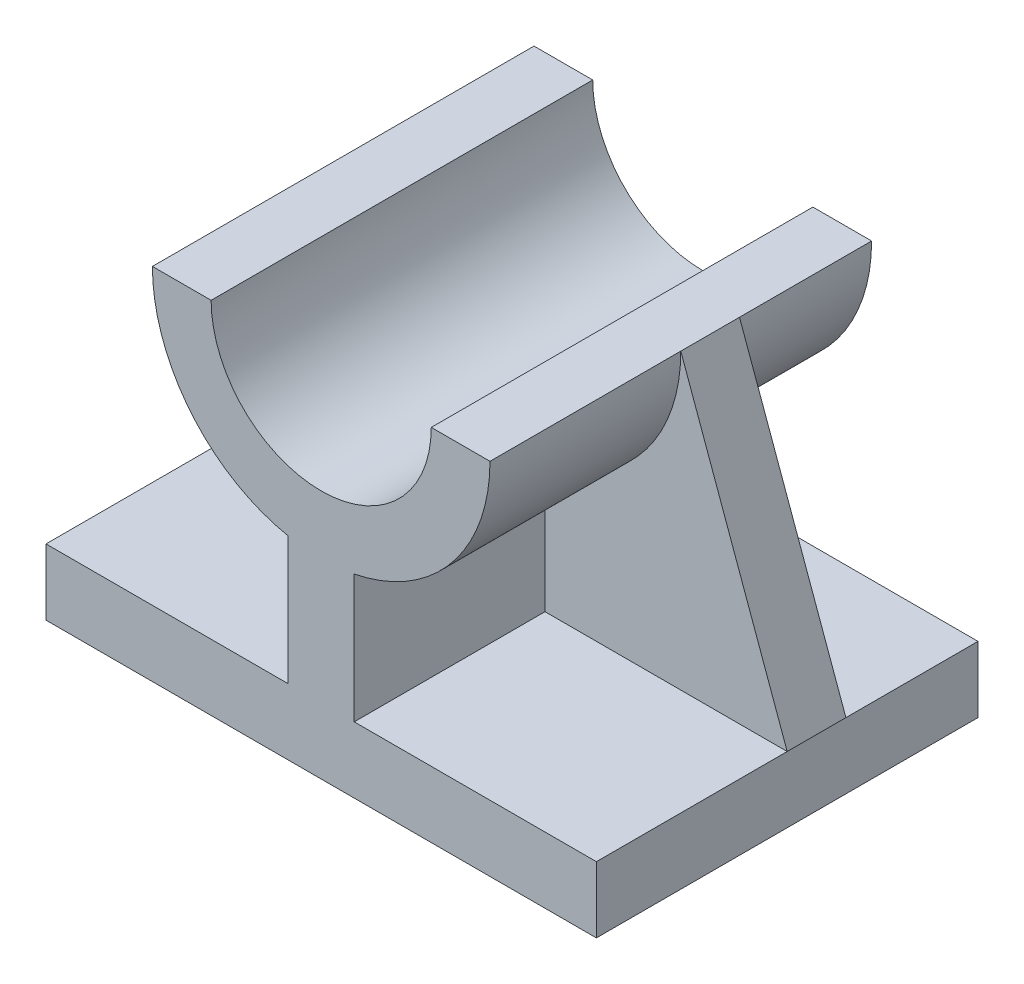
ISO-10303-21;
HEADER;
FILE_DESCRIPTION(('STEP AP214'),'2;1');
FILE_NAME('part.step','',(''),(''),'','','');
FILE_SCHEMA(('AUTOMOTIVE_DESIGN { 1 0 10303 214 1 1 1 1 }'));
ENDSEC;
DATA;
#1=APPLICATION_CONTEXT('core data for automotive mechanical design processes');
#2=APPLICATION_PROTOCOL_DEFINITION('international standard','automotive_design',2000,#1);
#3=PRODUCT_CONTEXT('',#1,'mechanical');
#4=PRODUCT('Part','Part','',(#3));
#5=PRODUCT_RELATED_PRODUCT_CATEGORY('part','',(#4));
#6=PRODUCT_DEFINITION_FORMATION('','',#4);
#7=PRODUCT_DEFINITION_CONTEXT('part definition',#1,'design');
#8=PRODUCT_DEFINITION('design','',#6,#7);
#9=PRODUCT_DEFINITION_SHAPE('','',#8);
#10=(LENGTH_UNIT() NAMED_UNIT(*) SI_UNIT(.MILLI.,.METRE.));
#11=(NAMED_UNIT(*) PLANE_ANGLE_UNIT() SI_UNIT($,.RADIAN.));
#12=(NAMED_UNIT(*) SI_UNIT($,.STERADIAN.) SOLID_ANGLE_UNIT());
#13=UNCERTAINTY_MEASURE_WITH_UNIT(LENGTH_MEASURE(1.E-05),#10,'distance_accuracy_value','');
#14=(GEOMETRIC_REPRESENTATION_CONTEXT(3) GLOBAL_UNCERTAINTY_ASSIGNED_CONTEXT((#13)) GLOBAL_UNIT_ASSIGNED_CONTEXT((#10,
#11,#12)) REPRESENTATION_CONTEXT('',''));
#15=CARTESIAN_POINT('',(0.,0.,0.));
#16=DIRECTION('',(0.,0.,1.));
#17=DIRECTION('',(1.,0.,0.));
#18=AXIS2_PLACEMENT_3D('',#15,#16,#17);
#19=CARTESIAN_POINT('',(0.,9.,0.));
#20=DIRECTION('',(0.,-1.,0.));
#21=DIRECTION('',(0.,0.,-1.));
#22=AXIS2_PLACEMENT_3D('',#19,#20,#21);
#23=PLANE('',#22);
#24=DIRECTION('',(-1.,0.,0.));
#25=VECTOR('',#24,1.);
#26=CARTESIAN_POINT('',(0.,9.,-34.));
#27=LINE('',#26,#25);
#28=CARTESIAN_POINT('',(33.,9.,-34.));
#29=VERTEX_POINT('',#28);
#30=CARTESIAN_POINT('',(0.,9.,-34.));
#31=VERTEX_POINT('',#30);
#32=EDGE_CURVE('E185',#29,#31,#27,.T.);
#33=ORIENTED_EDGE('',*,*,#32,.F.);
#34=DIRECTION('',(0.,0.,1.));
#35=VECTOR('',#34,1.);
#36=CARTESIAN_POINT('',(33.,9.,-52.));
#37=LINE('',#36,#35);
#38=CARTESIAN_POINT('',(33.,9.,-52.));
#39=VERTEX_POINT('',#38);
#40=EDGE_CURVE('E245',#39,#29,#37,.T.);
#41=ORIENTED_EDGE('',*,*,#40,.F.);
#42=DIRECTION('',(-1.,0.,0.));
#43=VECTOR('',#42,1.);
#44=CARTESIAN_POINT('',(0.,9.,-52.));
#45=LINE('',#44,#43);
#46=CARTESIAN_POINT('',(0.,9.,-52.));
#47=VERTEX_POINT('',#46);
#48=EDGE_CURVE('E237',#39,#47,#45,.T.);
#49=ORIENTED_EDGE('',*,*,#48,.T.);
#50=DIRECTION('',(0.,0.,1.));
#51=VECTOR('',#50,1.);
#52=CARTESIAN_POINT('',(0.,9.,0.));
#53=LINE('',#52,#51);
#54=EDGE_CURVE('E225',#47,#31,#53,.T.);
#55=ORIENTED_EDGE('',*,*,#54,.T.);
#56=EDGE_LOOP('',(#33,#41,#49,#55));
#57=FACE_BOUND('',#56,.T.);
#58=ADVANCED_FACE('F33',(#57),#23,.F.);
#59=CARTESIAN_POINT('',(33.,9.,-52.));
#60=DIRECTION('',(-1.,0.,0.));
#61=DIRECTION('',(0.,0.,1.));
#62=AXIS2_PLACEMENT_3D('',#59,#60,#61);
#63=PLANE('',#62);
#64=ORIENTED_EDGE('',*,*,#40,.T.);
#65=DIRECTION('',(0.,1.,0.));
#66=VECTOR('',#65,1.);
#67=CARTESIAN_POINT('',(33.,9.,-34.));
#68=LINE('',#67,#66);
#69=CARTESIAN_POINT('',(33.,26.4445128627201,-34.));
#70=VERTEX_POINT('',#69);
#71=EDGE_CURVE('E193',#29,#70,#68,.T.);
#72=ORIENTED_EDGE('',*,*,#71,.T.);
#73=DIRECTION('',(0.,0.,1.));
#74=VECTOR('',#73,1.);
#75=CARTESIAN_POINT('',(33.,26.4445128627201,-52.));
#76=LINE('',#75,#74);
#77=CARTESIAN_POINT('',(33.,26.4445128627201,-52.));
#78=VERTEX_POINT('',#77);
#79=EDGE_CURVE('E192',#78,#70,#76,.T.);
#80=ORIENTED_EDGE('',*,*,#79,.F.);
#81=DIRECTION('',(0.,-1.,0.));
#82=VECTOR('',#81,1.);
#83=CARTESIAN_POINT('',(33.,9.,-52.));
#84=LINE('',#83,#82);
#85=EDGE_CURVE('E297',#78,#39,#84,.T.);
#86=ORIENTED_EDGE('',*,*,#85,.T.);
#87=EDGE_LOOP('',(#64,#72,#80,#86));
#88=FACE_BOUND('',#87,.T.);
#89=ADVANCED_FACE('F354',(#88),#63,.T.);
#90=CARTESIAN_POINT('',(37.5,49.,-52.));
#91=DIRECTION('',(0.,0.,1.));
#92=DIRECTION('',(1.,0.,0.));
#93=AXIS2_PLACEMENT_3D('',#90,#91,#92);
#94=CYLINDRICAL_SURFACE('',#93,23.);
#95=ORIENTED_EDGE('',*,*,#79,.T.);
#96=CARTESIAN_POINT('',(37.5,49.,-34.));
#97=DIRECTION('',(0.,0.,1.));
#98=DIRECTION('',(1.,0.,0.));
#99=AXIS2_PLACEMENT_3D('',#96,#97,#98);
#100=CIRCLE('',#99,23.);
#101=CARTESIAN_POINT('',(14.5,49.,-34.));
#102=VERTEX_POINT('',#101);
#103=EDGE_CURVE('E182',#70,#102,#100,.F.);
#104=ORIENTED_EDGE('',*,*,#103,.T.);
#105=DIRECTION('',(0.,0.,1.));
#106=VECTOR('',#105,1.);
#107=CARTESIAN_POINT('',(14.5,49.,-52.));
#108=LINE('',#107,#106);
#109=CARTESIAN_POINT('',(14.5,49.,-52.));
#110=VERTEX_POINT('',#109);
#111=EDGE_CURVE('E176',#110,#102,#108,.T.);
#112=ORIENTED_EDGE('',*,*,#111,.F.);
#113=CARTESIAN_POINT('',(37.5,49.,-52.));
#114=DIRECTION('',(0.,0.,1.));
#115=DIRECTION('',(1.,0.,0.));
#116=AXIS2_PLACEMENT_3D('',#113,#114,#115);
#117=CIRCLE('',#116,23.);
#118=EDGE_CURVE('E295',#110,#78,#117,.T.);
#119=ORIENTED_EDGE('',*,*,#118,.T.);
#120=EDGE_LOOP('',(#95,#104,#112,#119));
#121=FACE_BOUND('',#120,.T.);
#122=ADVANCED_FACE('F189',(#121),#94,.T.);
#123=DIRECTION('',(-1.,0.,0.));
#124=VECTOR('',#123,1.);
#125=CARTESIAN_POINT('',(0.,9.,-34.));
#126=LINE('',#125,#124);
#127=CARTESIAN_POINT('',(75.,9.,-34.));
#128=VERTEX_POINT('',#127);
#129=CARTESIAN_POINT('',(42.,9.,-34.));
#130=VERTEX_POINT('',#129);
#131=EDGE_CURVE('E56',#128,#130,#126,.T.);
#132=ORIENTED_EDGE('',*,*,#131,.F.);
#133=DIRECTION('',(0.,0.,-1.));
#134=VECTOR('',#133,1.);
#135=CARTESIAN_POINT('',(75.,9.,0.));
#136=LINE('',#135,#134);
#137=CARTESIAN_POINT('',(75.,9.,-52.));
#138=VERTEX_POINT('',#137);
#139=EDGE_CURVE('E233',#128,#138,#136,.T.);
#140=ORIENTED_EDGE('',*,*,#139,.T.);
#141=CARTESIAN_POINT('',(42.,9.,-52.));
#142=VERTEX_POINT('',#141);
#143=EDGE_CURVE('E238',#138,#142,#45,.T.);
#144=ORIENTED_EDGE('',*,*,#143,.T.);
#145=DIRECTION('',(0.,0.,1.));
#146=VECTOR('',#145,1.);
#147=CARTESIAN_POINT('',(42.,9.,-52.));
#148=LINE('',#147,#146);
#149=EDGE_CURVE('E221',#142,#130,#148,.T.);
#150=ORIENTED_EDGE('',*,*,#149,.T.);
#151=EDGE_LOOP('',(#132,#140,#144,#150));
#152=FACE_BOUND('',#151,.T.);
#153=ADVANCED_FACE('F267',(#152),#23,.F.);
#154=CARTESIAN_POINT('',(37.5,49.,-52.));
#155=DIRECTION('',(0.,0.,1.));
#156=DIRECTION('',(1.,0.,0.));
#157=AXIS2_PLACEMENT_3D('',#154,#155,#156);
#158=CYLINDRICAL_SURFACE('',#157,23.);
#159=DIRECTION('',(0.,0.,1.));
#160=VECTOR('',#159,1.);
#161=CARTESIAN_POINT('',(60.5,49.,-52.));
#162=LINE('',#161,#160);
#163=CARTESIAN_POINT('',(60.5,49.,-52.));
#164=VERTEX_POINT('',#163);
#165=CARTESIAN_POINT('',(60.5,49.,-34.));
#166=VERTEX_POINT('',#165);
#167=EDGE_CURVE('E210',#164,#166,#162,.T.);
#168=ORIENTED_EDGE('',*,*,#167,.T.);
#169=CARTESIAN_POINT('',(37.5,49.,-34.));
#170=DIRECTION('',(0.,0.,1.));
#171=DIRECTION('',(1.,0.,0.));
#172=AXIS2_PLACEMENT_3D('',#169,#170,#171);
#173=CIRCLE('',#172,23.);
#174=CARTESIAN_POINT('',(42.,26.4445128627201,-34.));
#175=VERTEX_POINT('',#174);
#176=EDGE_CURVE('E367',#166,#175,#173,.F.);
#177=ORIENTED_EDGE('',*,*,#176,.T.);
#178=DIRECTION('',(0.,0.,1.));
#179=VECTOR('',#178,1.);
#180=CARTESIAN_POINT('',(42.,26.4445128627201,-52.));
#181=LINE('',#180,#179);
#182=CARTESIAN_POINT('',(42.,26.4445128627201,-52.));
#183=VERTEX_POINT('',#182);
#184=EDGE_CURVE('E217',#183,#175,#181,.T.);
#185=ORIENTED_EDGE('',*,*,#184,.F.);
#186=CARTESIAN_POINT('',(37.5,49.,-52.));
#187=DIRECTION('',(0.,0.,1.));
#188=DIRECTION('',(1.,0.,0.));
#189=AXIS2_PLACEMENT_3D('',#186,#187,#188);
#190=CIRCLE('',#189,23.);
#191=EDGE_CURVE('E278',#183,#164,#190,.T.);
#192=ORIENTED_EDGE('',*,*,#191,.T.);
#193=EDGE_LOOP('',(#168,#177,#185,#192));
#194=FACE_BOUND('',#193,.T.);
#195=ADVANCED_FACE('F396',(#194),#158,.T.);
#196=CARTESIAN_POINT('',(42.,9.,-52.));
#197=DIRECTION('',(1.,0.,0.));
#198=DIRECTION('',(0.,0.,-1.));
#199=AXIS2_PLACEMENT_3D('',#196,#197,#198);
#200=PLANE('',#199);
#201=ORIENTED_EDGE('',*,*,#184,.T.);
#202=DIRECTION('',(0.,-1.,0.));
#203=VECTOR('',#202,1.);
#204=CARTESIAN_POINT('',(42.,9.,-34.));
#205=LINE('',#204,#203);
#206=EDGE_CURVE('E41',#175,#130,#205,.T.);
#207=ORIENTED_EDGE('',*,*,#206,.T.);
#208=ORIENTED_EDGE('',*,*,#149,.F.);
#209=DIRECTION('',(0.,1.,0.));
#210=VECTOR('',#209,1.);
#211=CARTESIAN_POINT('',(42.,9.,-52.));
#212=LINE('',#211,#210);
#213=EDGE_CURVE('E275',#142,#183,#212,.T.);
#214=ORIENTED_EDGE('',*,*,#213,.T.);
#215=EDGE_LOOP('',(#201,#207,#208,#214));
#216=FACE_BOUND('',#215,.T.);
#217=ADVANCED_FACE('F262',(#216),#200,.T.);
#218=CARTESIAN_POINT('',(33.,9.,-26.));
#219=VERTEX_POINT('',#218);
#220=CARTESIAN_POINT('',(33.,9.,0.));
#221=VERTEX_POINT('',#220);
#222=EDGE_CURVE('E317',#219,#221,#37,.T.);
#223=ORIENTED_EDGE('',*,*,#222,.F.);
#224=DIRECTION('',(-1.,0.,0.));
#225=VECTOR('',#224,1.);
#226=CARTESIAN_POINT('',(0.,9.,-26.));
#227=LINE('',#226,#225);
#228=CARTESIAN_POINT('',(0.,9.,-26.));
#229=VERTEX_POINT('',#228);
#230=EDGE_CURVE('E333',#219,#229,#227,.T.);
#231=ORIENTED_EDGE('',*,*,#230,.T.);
#232=CARTESIAN_POINT('',(0.,9.,0.));
#233=VERTEX_POINT('',#232);
#234=EDGE_CURVE('E229',#229,#233,#53,.T.);
#235=ORIENTED_EDGE('',*,*,#234,.T.);
#236=DIRECTION('',(1.,0.,0.));
#237=VECTOR('',#236,1.);
#238=CARTESIAN_POINT('',(0.,9.,0.));
#239=LINE('',#238,#237);
#240=EDGE_CURVE('E230',#233,#221,#239,.T.);
#241=ORIENTED_EDGE('',*,*,#240,.T.);
#242=EDGE_LOOP('',(#223,#231,#235,#241));
#243=FACE_BOUND('',#242,.T.);
#244=ADVANCED_FACE('F331',(#243),#23,.F.);
#245=CARTESIAN_POINT('',(0.,9.,0.));
#246=DIRECTION('',(1.,0.,0.));
#247=DIRECTION('',(0.,0.,-1.));
#248=AXIS2_PLACEMENT_3D('',#245,#246,#247);
#249=PLANE('',#248);
#250=ORIENTED_EDGE('',*,*,#234,.F.);
#251=DIRECTION('',(0.,0.,1.));
#252=VECTOR('',#251,1.);
#253=CARTESIAN_POINT('',(0.,9.,0.));
#254=LINE('',#253,#252);
#255=EDGE_CURVE('E336',#31,#229,#254,.T.);
#256=ORIENTED_EDGE('',*,*,#255,.F.);
#257=ORIENTED_EDGE('',*,*,#54,.F.);
#258=DIRECTION('',(0.,-1.,0.));
#259=VECTOR('',#258,1.);
#260=CARTESIAN_POINT('',(0.,9.,-52.));
#261=LINE('',#260,#259);
#262=CARTESIAN_POINT('',(0.,0.,-52.));
#263=VERTEX_POINT('',#262);
#264=EDGE_CURVE('E241',#47,#263,#261,.T.);
#265=ORIENTED_EDGE('',*,*,#264,.T.);
#266=DIRECTION('',(0.,0.,1.));
#267=VECTOR('',#266,1.);
#268=CARTESIAN_POINT('',(0.,0.,0.));
#269=LINE('',#268,#267);
#270=CARTESIAN_POINT('',(0.,0.,0.));
#271=VERTEX_POINT('',#270);
#272=EDGE_CURVE('E242',#263,#271,#269,.T.);
#273=ORIENTED_EDGE('',*,*,#272,.T.);
#274=DIRECTION('',(0.,-1.,0.));
#275=VECTOR('',#274,1.);
#276=CARTESIAN_POINT('',(0.,9.,0.));
#277=LINE('',#276,#275);
#278=EDGE_CURVE('E259',#233,#271,#277,.T.);
#279=ORIENTED_EDGE('',*,*,#278,.F.);
#280=EDGE_LOOP('',(#250,#256,#257,#265,#273,#279));
#281=FACE_BOUND('',#280,.T.);
#282=ADVANCED_FACE('F35',(#281),#249,.F.);
#283=CARTESIAN_POINT('',(0.,9.,0.));
#284=DIRECTION('',(0.,0.,-1.));
#285=DIRECTION('',(-1.,0.,0.));
#286=AXIS2_PLACEMENT_3D('',#283,#284,#285);
#287=PLANE('',#286);
#288=DIRECTION('',(1.,0.,0.));
#289=VECTOR('',#288,1.);
#290=CARTESIAN_POINT('',(0.,0.,0.));
#291=LINE('',#290,#289);
#292=CARTESIAN_POINT('',(75.,0.,0.));
#293=VERTEX_POINT('',#292);
#294=EDGE_CURVE('E244',#271,#293,#291,.T.);
#295=ORIENTED_EDGE('',*,*,#294,.T.);
#296=DIRECTION('',(0.,-1.,0.));
#297=VECTOR('',#296,1.);
#298=CARTESIAN_POINT('',(75.,9.,0.));
#299=LINE('',#298,#297);
#300=CARTESIAN_POINT('',(75.,9.,0.));
#301=VERTEX_POINT('',#300);
#302=EDGE_CURVE('E256',#301,#293,#299,.T.);
#303=ORIENTED_EDGE('',*,*,#302,.F.);
#304=CARTESIAN_POINT('',(42.,9.,0.));
#305=VERTEX_POINT('',#304);
#306=EDGE_CURVE('E228',#305,#301,#239,.T.);
#307=ORIENTED_EDGE('',*,*,#306,.F.);
#308=DIRECTION('',(0.,1.,0.));
#309=VECTOR('',#308,1.);
#310=CARTESIAN_POINT('',(42.,9.,0.));
#311=LINE('',#310,#309);
#312=CARTESIAN_POINT('',(42.,26.4445128627201,0.));
#313=VERTEX_POINT('',#312);
#314=EDGE_CURVE('E299',#305,#313,#311,.T.);
#315=ORIENTED_EDGE('',*,*,#314,.T.);
#316=CARTESIAN_POINT('',(37.5,49.,0.));
#317=DIRECTION('',(0.,0.,1.));
#318=DIRECTION('',(1.,0.,0.));
#319=AXIS2_PLACEMENT_3D('',#316,#317,#318);
#320=CIRCLE('',#319,23.);
#321=CARTESIAN_POINT('',(60.5,49.,0.));
#322=VERTEX_POINT('',#321);
#323=EDGE_CURVE('E302',#313,#322,#320,.T.);
#324=ORIENTED_EDGE('',*,*,#323,.T.);
#325=DIRECTION('',(-1.,0.,0.));
#326=VECTOR('',#325,1.);
#327=CARTESIAN_POINT('',(52.5,49.,0.));
#328=LINE('',#327,#326);
#329=CARTESIAN_POINT('',(52.5,49.,0.));
#330=VERTEX_POINT('',#329);
#331=EDGE_CURVE('E305',#322,#330,#328,.T.);
#332=ORIENTED_EDGE('',*,*,#331,.T.);
#333=CARTESIAN_POINT('',(37.5,49.,0.));
#334=DIRECTION('',(0.,0.,-1.));
#335=DIRECTION('',(1.,0.,0.));
#336=AXIS2_PLACEMENT_3D('',#333,#334,#335);
#337=CIRCLE('',#336,15.);
#338=CARTESIAN_POINT('',(22.5,49.,0.));
#339=VERTEX_POINT('',#338);
#340=EDGE_CURVE('E308',#330,#339,#337,.T.);
#341=ORIENTED_EDGE('',*,*,#340,.T.);
#342=DIRECTION('',(-1.,0.,0.));
#343=VECTOR('',#342,1.);
#344=CARTESIAN_POINT('',(14.5,49.,0.));
#345=LINE('',#344,#343);
#346=CARTESIAN_POINT('',(14.5,49.,0.));
#347=VERTEX_POINT('',#346);
#348=EDGE_CURVE('E311',#339,#347,#345,.T.);
#349=ORIENTED_EDGE('',*,*,#348,.T.);
#350=CARTESIAN_POINT('',(37.5,49.,0.));
#351=DIRECTION('',(0.,0.,1.));
#352=DIRECTION('',(1.,0.,0.));
#353=AXIS2_PLACEMENT_3D('',#350,#351,#352);
#354=CIRCLE('',#353,23.);
#355=CARTESIAN_POINT('',(33.,26.4445128627201,0.));
#356=VERTEX_POINT('',#355);
#357=EDGE_CURVE('E284',#347,#356,#354,.T.);
#358=ORIENTED_EDGE('',*,*,#357,.T.);
#359=DIRECTION('',(0.,-1.,0.));
#360=VECTOR('',#359,1.);
#361=CARTESIAN_POINT('',(33.,9.,0.));
#362=LINE('',#361,#360);
#363=EDGE_CURVE('E279',#356,#221,#362,.T.);
#364=ORIENTED_EDGE('',*,*,#363,.T.);
#365=ORIENTED_EDGE('',*,*,#240,.F.);
#366=ORIENTED_EDGE('',*,*,#278,.T.);
#367=EDGE_LOOP('',(#295,#303,#307,#315,#324,#332,#341,#349,#358,#364,#365,#366));
#368=FACE_BOUND('',#367,.T.);
#369=ADVANCED_FACE('F329',(#368),#287,.F.);
#370=CARTESIAN_POINT('',(75.,9.,0.));
#371=DIRECTION('',(-1.,0.,0.));
#372=DIRECTION('',(0.,0.,1.));
#373=AXIS2_PLACEMENT_3D('',#370,#371,#372);
#374=PLANE('',#373);
#375=DIRECTION('',(0.,0.,-1.));
#376=VECTOR('',#375,1.);
#377=CARTESIAN_POINT('',(75.,0.,0.));
#378=LINE('',#377,#376);
#379=CARTESIAN_POINT('',(75.,0.,-52.));
#380=VERTEX_POINT('',#379);
#381=EDGE_CURVE('E247',#293,#380,#378,.T.);
#382=ORIENTED_EDGE('',*,*,#381,.T.);
#383=DIRECTION('',(0.,-1.,0.));
#384=VECTOR('',#383,1.);
#385=CARTESIAN_POINT('',(75.,9.,-52.));
#386=LINE('',#385,#384);
#387=EDGE_CURVE('E253',#138,#380,#386,.T.);
#388=ORIENTED_EDGE('',*,*,#387,.F.);
#389=ORIENTED_EDGE('',*,*,#139,.F.);
#390=DIRECTION('',(0.,0.,-1.));
#391=VECTOR('',#390,1.);
#392=CARTESIAN_POINT('',(75.,9.,0.));
#393=LINE('',#392,#391);
#394=CARTESIAN_POINT('',(75.,9.,-26.));
#395=VERTEX_POINT('',#394);
#396=EDGE_CURVE('E287',#128,#395,#393,.F.);
#397=ORIENTED_EDGE('',*,*,#396,.T.);
#398=EDGE_CURVE('E234',#301,#395,#136,.T.);
#399=ORIENTED_EDGE('',*,*,#398,.F.);
#400=ORIENTED_EDGE('',*,*,#302,.T.);
#401=EDGE_LOOP('',(#382,#388,#389,#397,#399,#400));
#402=FACE_BOUND('',#401,.T.);
#403=ADVANCED_FACE('F345',(#402),#374,.F.);
#404=CARTESIAN_POINT('',(0.,9.,-52.));
#405=DIRECTION('',(0.,0.,1.));
#406=DIRECTION('',(1.,0.,0.));
#407=AXIS2_PLACEMENT_3D('',#404,#405,#406);
#408=PLANE('',#407);
#409=DIRECTION('',(-1.,0.,0.));
#410=VECTOR('',#409,1.);
#411=CARTESIAN_POINT('',(0.,0.,-52.));
#412=LINE('',#411,#410);
#413=EDGE_CURVE('E249',#380,#263,#412,.T.);
#414=ORIENTED_EDGE('',*,*,#413,.T.);
#415=ORIENTED_EDGE('',*,*,#264,.F.);
#416=ORIENTED_EDGE('',*,*,#48,.F.);
#417=ORIENTED_EDGE('',*,*,#85,.F.);
#418=ORIENTED_EDGE('',*,*,#118,.F.);
#419=DIRECTION('',(-1.,0.,0.));
#420=VECTOR('',#419,1.);
#421=CARTESIAN_POINT('',(14.5,49.,-52.));
#422=LINE('',#421,#420);
#423=CARTESIAN_POINT('',(22.5,49.,-52.));
#424=VERTEX_POINT('',#423);
#425=EDGE_CURVE('E199',#424,#110,#422,.T.);
#426=ORIENTED_EDGE('',*,*,#425,.F.);
#427=CARTESIAN_POINT('',(37.5,49.,-52.));
#428=DIRECTION('',(0.,0.,-1.));
#429=DIRECTION('',(1.,0.,0.));
#430=AXIS2_PLACEMENT_3D('',#427,#428,#429);
#431=CIRCLE('',#430,15.);
#432=CARTESIAN_POINT('',(52.5,49.,-52.));
#433=VERTEX_POINT('',#432);
#434=EDGE_CURVE('E292',#433,#424,#431,.T.);
#435=ORIENTED_EDGE('',*,*,#434,.F.);
#436=DIRECTION('',(-1.,0.,0.));
#437=VECTOR('',#436,1.);
#438=CARTESIAN_POINT('',(52.5,49.,-52.));
#439=LINE('',#438,#437);
#440=EDGE_CURVE('E281',#164,#433,#439,.T.);
#441=ORIENTED_EDGE('',*,*,#440,.F.);
#442=ORIENTED_EDGE('',*,*,#191,.F.);
#443=ORIENTED_EDGE('',*,*,#213,.F.);
#444=ORIENTED_EDGE('',*,*,#143,.F.);
#445=ORIENTED_EDGE('',*,*,#387,.T.);
#446=EDGE_LOOP('',(#414,#415,#416,#417,#418,#426,#435,#441,#442,#443,#444,#445));
#447=FACE_BOUND('',#446,.T.);
#448=ADVANCED_FACE('F272',(#447),#408,.F.);
#449=ORIENTED_EDGE('',*,*,#398,.T.);
#450=DIRECTION('',(-1.,0.,0.));
#451=VECTOR('',#450,1.);
#452=CARTESIAN_POINT('',(0.,9.,-26.));
#453=LINE('',#452,#451);
#454=CARTESIAN_POINT('',(42.,9.,-26.));
#455=VERTEX_POINT('',#454);
#456=EDGE_CURVE('E372',#395,#455,#453,.T.);
#457=ORIENTED_EDGE('',*,*,#456,.T.);
#458=EDGE_CURVE('E224',#455,#305,#148,.T.);
#459=ORIENTED_EDGE('',*,*,#458,.T.);
#460=ORIENTED_EDGE('',*,*,#306,.T.);
#461=EDGE_LOOP('',(#449,#457,#459,#460));
#462=FACE_BOUND('',#461,.T.);
#463=ADVANCED_FACE('F378',(#462),#23,.F.);
#464=CARTESIAN_POINT('',(0.,0.,0.));
#465=DIRECTION('',(0.,-1.,0.));
#466=DIRECTION('',(0.,0.,-1.));
#467=AXIS2_PLACEMENT_3D('',#464,#465,#466);
#468=PLANE('',#467);
#469=ORIENTED_EDGE('',*,*,#294,.F.);
#470=ORIENTED_EDGE('',*,*,#272,.F.);
#471=ORIENTED_EDGE('',*,*,#413,.F.);
#472=ORIENTED_EDGE('',*,*,#381,.F.);
#473=EDGE_LOOP('',(#469,#470,#471,#472));
#474=FACE_BOUND('',#473,.T.);
#475=ADVANCED_FACE('F347',(#474),#468,.T.);
#476=DIRECTION('',(0.,1.,0.));
#477=VECTOR('',#476,1.);
#478=CARTESIAN_POINT('',(33.,9.,-26.));
#479=LINE('',#478,#477);
#480=CARTESIAN_POINT('',(33.,26.4445128627201,-26.));
#481=VERTEX_POINT('',#480);
#482=EDGE_CURVE('E324',#219,#481,#479,.T.);
#483=ORIENTED_EDGE('',*,*,#482,.F.);
#484=ORIENTED_EDGE('',*,*,#222,.T.);
#485=ORIENTED_EDGE('',*,*,#363,.F.);
#486=EDGE_CURVE('E200',#481,#356,#76,.T.);
#487=ORIENTED_EDGE('',*,*,#486,.F.);
#488=EDGE_LOOP('',(#483,#484,#485,#487));
#489=FACE_BOUND('',#488,.T.);
#490=ADVANCED_FACE('F322',(#489),#63,.T.);
#491=CARTESIAN_POINT('',(37.5,49.,-26.));
#492=DIRECTION('',(0.,0.,1.));
#493=DIRECTION('',(1.,0.,0.));
#494=AXIS2_PLACEMENT_3D('',#491,#492,#493);
#495=CIRCLE('',#494,23.);
#496=CARTESIAN_POINT('',(14.5,49.,-26.));
#497=VERTEX_POINT('',#496);
#498=EDGE_CURVE('E356',#481,#497,#495,.F.);
#499=ORIENTED_EDGE('',*,*,#498,.F.);
#500=ORIENTED_EDGE('',*,*,#486,.T.);
#501=ORIENTED_EDGE('',*,*,#357,.F.);
#502=EDGE_CURVE('E177',#497,#347,#108,.T.);
#503=ORIENTED_EDGE('',*,*,#502,.F.);
#504=EDGE_LOOP('',(#499,#500,#501,#503));
#505=FACE_BOUND('',#504,.T.);
#506=ADVANCED_FACE('F448',(#505),#94,.T.);
#507=CARTESIAN_POINT('',(14.5,49.,-52.));
#508=DIRECTION('',(0.,1.,0.));
#509=DIRECTION('',(0.,0.,1.));
#510=AXIS2_PLACEMENT_3D('',#507,#508,#509);
#511=PLANE('',#510);
#512=ORIENTED_EDGE('',*,*,#348,.F.);
#513=DIRECTION('',(0.,0.,1.));
#514=VECTOR('',#513,1.);
#515=CARTESIAN_POINT('',(22.5,49.,-52.));
#516=LINE('',#515,#514);
#517=EDGE_CURVE('E203',#424,#339,#516,.T.);
#518=ORIENTED_EDGE('',*,*,#517,.F.);
#519=ORIENTED_EDGE('',*,*,#425,.T.);
#520=ORIENTED_EDGE('',*,*,#111,.T.);
#521=EDGE_CURVE('E169',#102,#497,#108,.T.);
#522=ORIENTED_EDGE('',*,*,#521,.T.);
#523=ORIENTED_EDGE('',*,*,#502,.T.);
#524=EDGE_LOOP('',(#512,#518,#519,#520,#522,#523));
#525=FACE_BOUND('',#524,.T.);
#526=ADVANCED_FACE('F197',(#525),#511,.T.);
#527=CARTESIAN_POINT('',(37.5,49.,-52.));
#528=DIRECTION('',(0.,0.,1.));
#529=DIRECTION('',(1.,0.,0.));
#530=AXIS2_PLACEMENT_3D('',#527,#528,#529);
#531=CYLINDRICAL_SURFACE('',#530,15.);
#532=ORIENTED_EDGE('',*,*,#340,.F.);
#533=DIRECTION('',(0.,0.,1.));
#534=VECTOR('',#533,1.);
#535=CARTESIAN_POINT('',(52.5,49.,-52.));
#536=LINE('',#535,#534);
#537=EDGE_CURVE('E206',#433,#330,#536,.T.);
#538=ORIENTED_EDGE('',*,*,#537,.F.);
#539=ORIENTED_EDGE('',*,*,#434,.T.);
#540=ORIENTED_EDGE('',*,*,#517,.T.);
#541=EDGE_LOOP('',(#532,#538,#539,#540));
#542=FACE_BOUND('',#541,.T.);
#543=ADVANCED_FACE('F393',(#542),#531,.F.);
#544=CARTESIAN_POINT('',(52.5,49.,-52.));
#545=DIRECTION('',(0.,1.,0.));
#546=DIRECTION('',(0.,0.,1.));
#547=AXIS2_PLACEMENT_3D('',#544,#545,#546);
#548=PLANE('',#547);
#549=CARTESIAN_POINT('',(60.5,49.,-26.));
#550=VERTEX_POINT('',#549);
#551=EDGE_CURVE('E216',#550,#322,#162,.T.);
#552=ORIENTED_EDGE('',*,*,#551,.F.);
#553=EDGE_CURVE('E215',#166,#550,#162,.T.);
#554=ORIENTED_EDGE('',*,*,#553,.F.);
#555=ORIENTED_EDGE('',*,*,#167,.F.);
#556=ORIENTED_EDGE('',*,*,#440,.T.);
#557=ORIENTED_EDGE('',*,*,#537,.T.);
#558=ORIENTED_EDGE('',*,*,#331,.F.);
#559=EDGE_LOOP('',(#552,#554,#555,#556,#557,#558));
#560=FACE_BOUND('',#559,.T.);
#561=ADVANCED_FACE('F392',(#560),#548,.T.);
#562=CARTESIAN_POINT('',(37.5,49.,-26.));
#563=DIRECTION('',(0.,0.,1.));
#564=DIRECTION('',(1.,0.,0.));
#565=AXIS2_PLACEMENT_3D('',#562,#563,#564);
#566=CIRCLE('',#565,23.);
#567=CARTESIAN_POINT('',(42.,26.4445128627201,-26.));
#568=VERTEX_POINT('',#567);
#569=EDGE_CURVE('E371',#550,#568,#566,.F.);
#570=ORIENTED_EDGE('',*,*,#569,.F.);
#571=ORIENTED_EDGE('',*,*,#551,.T.);
#572=ORIENTED_EDGE('',*,*,#323,.F.);
#573=EDGE_CURVE('E220',#568,#313,#181,.T.);
#574=ORIENTED_EDGE('',*,*,#573,.F.);
#575=EDGE_LOOP('',(#570,#571,#572,#574));
#576=FACE_BOUND('',#575,.T.);
#577=ADVANCED_FACE('F387',(#576),#158,.T.);
#578=DIRECTION('',(0.,-1.,0.));
#579=VECTOR('',#578,1.);
#580=CARTESIAN_POINT('',(42.,9.,-26.));
#581=LINE('',#580,#579);
#582=EDGE_CURVE('E11',#568,#455,#581,.T.);
#583=ORIENTED_EDGE('',*,*,#582,.F.);
#584=ORIENTED_EDGE('',*,*,#573,.T.);
#585=ORIENTED_EDGE('',*,*,#314,.F.);
#586=ORIENTED_EDGE('',*,*,#458,.F.);
#587=EDGE_LOOP('',(#583,#584,#585,#586));
#588=FACE_BOUND('',#587,.T.);
#589=ADVANCED_FACE('F383',(#588),#200,.T.);
#590=CARTESIAN_POINT('',(60.5,49.,-30.));
#591=DIRECTION('',(-0.940136065162483,-0.3407993236214,0.));
#592=DIRECTION('',(0.3407993236214,-0.940136065162483,0.));
#593=AXIS2_PLACEMENT_3D('',#590,#591,#592);
#594=PLANE('',#593);
#595=ORIENTED_EDGE('',*,*,#396,.F.);
#596=DIRECTION('',(0.3407993236214,-0.940136065162483,0.));
#597=VECTOR('',#596,1.);
#598=CARTESIAN_POINT('',(60.5,49.,-34.));
#599=LINE('',#598,#597);
#600=EDGE_CURVE('E363',#166,#128,#599,.T.);
#601=ORIENTED_EDGE('',*,*,#600,.F.);
#602=ORIENTED_EDGE('',*,*,#553,.T.);
#603=DIRECTION('',(0.3407993236214,-0.940136065162483,0.));
#604=VECTOR('',#603,1.);
#605=CARTESIAN_POINT('',(60.5,49.,-26.));
#606=LINE('',#605,#604);
#607=EDGE_CURVE('E364',#550,#395,#606,.T.);
#608=ORIENTED_EDGE('',*,*,#607,.T.);
#609=EDGE_LOOP('',(#595,#601,#602,#608));
#610=FACE_BOUND('',#609,.T.);
#611=ADVANCED_FACE('F398',(#610),#594,.F.);
#612=CARTESIAN_POINT('',(37.5,24.5,-26.));
#613=DIRECTION('',(0.,0.,1.));
#614=DIRECTION('',(1.,0.,0.));
#615=AXIS2_PLACEMENT_3D('',#612,#613,#614);
#616=PLANE('',#615);
#617=ORIENTED_EDGE('',*,*,#456,.F.);
#618=ORIENTED_EDGE('',*,*,#607,.F.);
#619=ORIENTED_EDGE('',*,*,#569,.T.);
#620=ORIENTED_EDGE('',*,*,#582,.T.);
#621=EDGE_LOOP('',(#617,#618,#619,#620));
#622=FACE_BOUND('',#621,.T.);
#623=ADVANCED_FACE('F401',(#622),#616,.T.);
#624=CARTESIAN_POINT('',(37.5,24.5,-34.));
#625=DIRECTION('',(0.,0.,1.));
#626=DIRECTION('',(1.,0.,0.));
#627=AXIS2_PLACEMENT_3D('',#624,#625,#626);
#628=PLANE('',#627);
#629=ORIENTED_EDGE('',*,*,#600,.T.);
#630=ORIENTED_EDGE('',*,*,#131,.T.);
#631=ORIENTED_EDGE('',*,*,#206,.F.);
#632=ORIENTED_EDGE('',*,*,#176,.F.);
#633=EDGE_LOOP('',(#629,#630,#631,#632));
#634=FACE_BOUND('',#633,.T.);
#635=ADVANCED_FACE('F397',(#634),#628,.F.);
#636=CARTESIAN_POINT('',(14.5,49.,-30.));
#637=DIRECTION('',(-0.940136065162483,0.3407993236214,0.));
#638=DIRECTION('',(-0.3407993236214,-0.940136065162483,0.));
#639=AXIS2_PLACEMENT_3D('',#636,#637,#638);
#640=PLANE('',#639);
#641=DIRECTION('',(-0.3407993236214,-0.940136065162483,0.));
#642=VECTOR('',#641,1.);
#643=CARTESIAN_POINT('',(14.5,49.,-34.));
#644=LINE('',#643,#642);
#645=EDGE_CURVE('E172',#102,#31,#644,.T.);
#646=ORIENTED_EDGE('',*,*,#645,.T.);
#647=ORIENTED_EDGE('',*,*,#255,.T.);
#648=DIRECTION('',(-0.3407993236214,-0.940136065162483,0.));
#649=VECTOR('',#648,1.);
#650=CARTESIAN_POINT('',(14.5,49.,-26.));
#651=LINE('',#650,#649);
#652=EDGE_CURVE('E48',#497,#229,#651,.T.);
#653=ORIENTED_EDGE('',*,*,#652,.F.);
#654=ORIENTED_EDGE('',*,*,#521,.F.);
#655=EDGE_LOOP('',(#646,#647,#653,#654));
#656=FACE_BOUND('',#655,.T.);
#657=ADVANCED_FACE('F171',(#656),#640,.T.);
#658=CARTESIAN_POINT('',(37.5,24.5,-26.));
#659=DIRECTION('',(0.,0.,1.));
#660=DIRECTION('',(1.,0.,0.));
#661=AXIS2_PLACEMENT_3D('',#658,#659,#660);
#662=PLANE('',#661);
#663=ORIENTED_EDGE('',*,*,#230,.F.);
#664=ORIENTED_EDGE('',*,*,#482,.T.);
#665=ORIENTED_EDGE('',*,*,#498,.T.);
#666=ORIENTED_EDGE('',*,*,#652,.T.);
#667=EDGE_LOOP('',(#663,#664,#665,#666));
#668=FACE_BOUND('',#667,.T.);
#669=ADVANCED_FACE('F482',(#668),#662,.T.);
#670=CARTESIAN_POINT('',(37.5,24.5,-34.));
#671=DIRECTION('',(0.,0.,1.));
#672=DIRECTION('',(1.,0.,0.));
#673=AXIS2_PLACEMENT_3D('',#670,#671,#672);
#674=PLANE('',#673);
#675=ORIENTED_EDGE('',*,*,#71,.F.);
#676=ORIENTED_EDGE('',*,*,#32,.T.);
#677=ORIENTED_EDGE('',*,*,#645,.F.);
#678=ORIENTED_EDGE('',*,*,#103,.F.);
#679=EDGE_LOOP('',(#675,#676,#677,#678));
#680=FACE_BOUND('',#679,.T.);
#681=ADVANCED_FACE('F181',(#680),#674,.F.);
#682=CLOSED_SHELL('',(#58,#89,#122,#153,#195,#217,#244,#282,#369,#403,#448,#463,#475,#490,#506,
#526,#543,#561,#577,#589,#611,#623,#635,#657,#669,#681));
#683=MANIFOLD_SOLID_BREP('B2',#682);
#684=ADVANCED_BREP_SHAPE_REPRESENTATION('',(#18,#683),#14);
#685=SHAPE_DEFINITION_REPRESENTATION(#9,#684);
ENDSEC;
END-ISO-10303-21;
